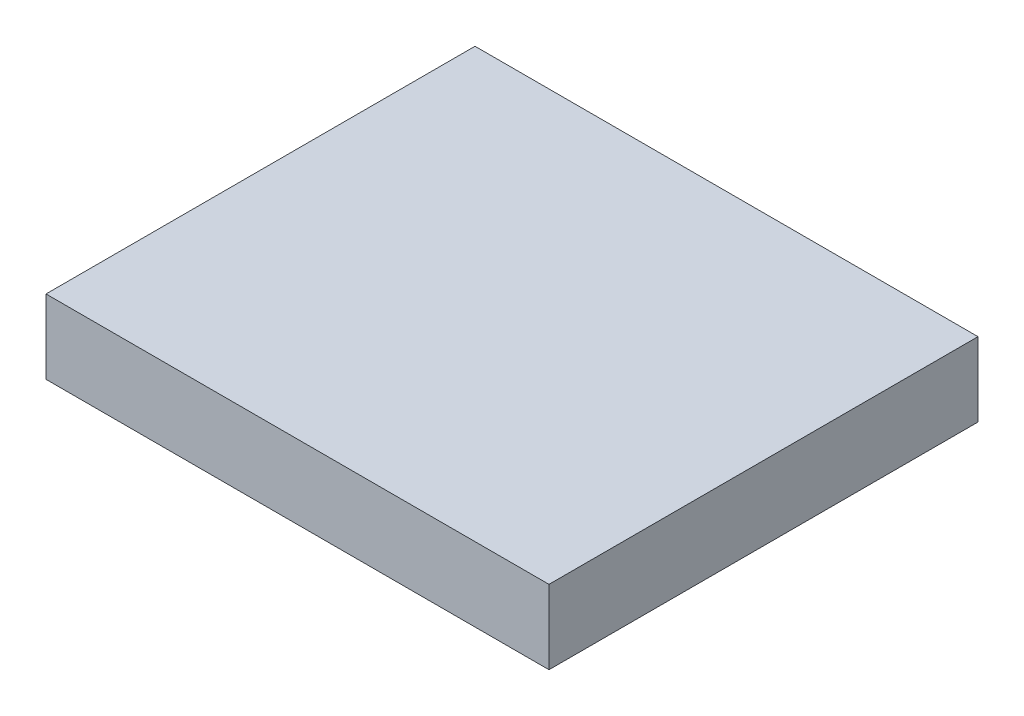
ISO-10303-21;
HEADER;
FILE_DESCRIPTION(('STEP AP214'),'2;1');
FILE_NAME('part.step','',(''),(''),'','','');
FILE_SCHEMA(('AUTOMOTIVE_DESIGN { 1 0 10303 214 1 1 1 1 }'));
ENDSEC;
DATA;
#1=APPLICATION_CONTEXT('core data for automotive mechanical design processes');
#2=APPLICATION_PROTOCOL_DEFINITION('international standard','automotive_design',2000,#1);
#3=PRODUCT_CONTEXT('',#1,'mechanical');
#4=PRODUCT('Part','Part','',(#3));
#5=PRODUCT_RELATED_PRODUCT_CATEGORY('part','',(#4));
#6=PRODUCT_DEFINITION_FORMATION('','',#4);
#7=PRODUCT_DEFINITION_CONTEXT('part definition',#1,'design');
#8=PRODUCT_DEFINITION('design','',#6,#7);
#9=PRODUCT_DEFINITION_SHAPE('','',#8);
#10=(LENGTH_UNIT() NAMED_UNIT(*) SI_UNIT(.MILLI.,.METRE.));
#11=(NAMED_UNIT(*) PLANE_ANGLE_UNIT() SI_UNIT($,.RADIAN.));
#12=(NAMED_UNIT(*) SI_UNIT($,.STERADIAN.) SOLID_ANGLE_UNIT());
#13=UNCERTAINTY_MEASURE_WITH_UNIT(LENGTH_MEASURE(1.E-05),#10,'distance_accuracy_value','');
#14=(GEOMETRIC_REPRESENTATION_CONTEXT(3) GLOBAL_UNCERTAINTY_ASSIGNED_CONTEXT((#13)) GLOBAL_UNIT_ASSIGNED_CONTEXT((#10,
#11,#12)) REPRESENTATION_CONTEXT('',''));
#15=CARTESIAN_POINT('',(0.,0.,0.));
#16=DIRECTION('',(0.,0.,1.));
#17=DIRECTION('',(1.,0.,0.));
#18=AXIS2_PLACEMENT_3D('',#15,#16,#17);
#19=CARTESIAN_POINT('',(17.,5.,-14.5));
#20=DIRECTION('',(-1.,0.,0.));
#21=DIRECTION('',(0.,0.,1.));
#22=AXIS2_PLACEMENT_3D('',#19,#20,#21);
#23=PLANE('',#22);
#24=DIRECTION('',(0.,0.,-1.));
#25=VECTOR('',#24,1.);
#26=CARTESIAN_POINT('',(17.,0.,-14.5));
#27=LINE('',#26,#25);
#28=CARTESIAN_POINT('',(17.,0.,14.5));
#29=VERTEX_POINT('',#28);
#30=CARTESIAN_POINT('',(17.,0.,-14.5));
#31=VERTEX_POINT('',#30);
#32=EDGE_CURVE('E104',#29,#31,#27,.T.);
#33=ORIENTED_EDGE('',*,*,#32,.T.);
#34=DIRECTION('',(0.,-1.,0.));
#35=VECTOR('',#34,1.);
#36=CARTESIAN_POINT('',(17.,5.,-14.5));
#37=LINE('',#36,#35);
#38=CARTESIAN_POINT('',(17.,5.,-14.5));
#39=VERTEX_POINT('',#38);
#40=EDGE_CURVE('E11',#39,#31,#37,.T.);
#41=ORIENTED_EDGE('',*,*,#40,.F.);
#42=DIRECTION('',(0.,0.,-1.));
#43=VECTOR('',#42,1.);
#44=CARTESIAN_POINT('',(17.,5.,-14.5));
#45=LINE('',#44,#43);
#46=CARTESIAN_POINT('',(17.,5.,14.5));
#47=VERTEX_POINT('',#46);
#48=EDGE_CURVE('E92',#47,#39,#45,.T.);
#49=ORIENTED_EDGE('',*,*,#48,.F.);
#50=DIRECTION('',(0.,-1.,0.));
#51=VECTOR('',#50,1.);
#52=CARTESIAN_POINT('',(17.,5.,14.5));
#53=LINE('',#52,#51);
#54=EDGE_CURVE('E100',#47,#29,#53,.T.);
#55=ORIENTED_EDGE('',*,*,#54,.T.);
#56=EDGE_LOOP('',(#33,#41,#49,#55));
#57=FACE_BOUND('',#56,.T.);
#58=ADVANCED_FACE('F41',(#57),#23,.F.);
#59=CARTESIAN_POINT('',(-17.,5.,-14.5));
#60=DIRECTION('',(0.,0.,1.));
#61=DIRECTION('',(1.,0.,0.));
#62=AXIS2_PLACEMENT_3D('',#59,#60,#61);
#63=PLANE('',#62);
#64=DIRECTION('',(-1.,0.,0.));
#65=VECTOR('',#64,1.);
#66=CARTESIAN_POINT('',(-17.,0.,-14.5));
#67=LINE('',#66,#65);
#68=CARTESIAN_POINT('',(-17.,0.,-14.5));
#69=VERTEX_POINT('',#68);
#70=EDGE_CURVE('E96',#31,#69,#67,.T.);
#71=ORIENTED_EDGE('',*,*,#70,.T.);
#72=DIRECTION('',(0.,-1.,0.));
#73=VECTOR('',#72,1.);
#74=CARTESIAN_POINT('',(-17.,5.,-14.5));
#75=LINE('',#74,#73);
#76=CARTESIAN_POINT('',(-17.,5.,-14.5));
#77=VERTEX_POINT('',#76);
#78=EDGE_CURVE('E49',#77,#69,#75,.T.);
#79=ORIENTED_EDGE('',*,*,#78,.F.);
#80=DIRECTION('',(-1.,0.,0.));
#81=VECTOR('',#80,1.);
#82=CARTESIAN_POINT('',(-17.,5.,-14.5));
#83=LINE('',#82,#81);
#84=EDGE_CURVE('E87',#39,#77,#83,.T.);
#85=ORIENTED_EDGE('',*,*,#84,.F.);
#86=ORIENTED_EDGE('',*,*,#40,.T.);
#87=EDGE_LOOP('',(#71,#79,#85,#86));
#88=FACE_BOUND('',#87,.T.);
#89=ADVANCED_FACE('F95',(#88),#63,.F.);
#90=CARTESIAN_POINT('',(-17.,5.,-14.5));
#91=DIRECTION('',(1.,0.,0.));
#92=DIRECTION('',(0.,0.,-1.));
#93=AXIS2_PLACEMENT_3D('',#90,#91,#92);
#94=PLANE('',#93);
#95=DIRECTION('',(0.,0.,1.));
#96=VECTOR('',#95,1.);
#97=CARTESIAN_POINT('',(-17.,0.,-14.5));
#98=LINE('',#97,#96);
#99=CARTESIAN_POINT('',(-17.,0.,14.5));
#100=VERTEX_POINT('',#99);
#101=EDGE_CURVE('E74',#69,#100,#98,.T.);
#102=ORIENTED_EDGE('',*,*,#101,.T.);
#103=DIRECTION('',(0.,-1.,0.));
#104=VECTOR('',#103,1.);
#105=CARTESIAN_POINT('',(-17.,5.,14.5));
#106=LINE('',#105,#104);
#107=CARTESIAN_POINT('',(-17.,5.,14.5));
#108=VERTEX_POINT('',#107);
#109=EDGE_CURVE('E97',#108,#100,#106,.T.);
#110=ORIENTED_EDGE('',*,*,#109,.F.);
#111=DIRECTION('',(0.,0.,1.));
#112=VECTOR('',#111,1.);
#113=CARTESIAN_POINT('',(-17.,5.,-14.5));
#114=LINE('',#113,#112);
#115=EDGE_CURVE('E90',#77,#108,#114,.T.);
#116=ORIENTED_EDGE('',*,*,#115,.F.);
#117=ORIENTED_EDGE('',*,*,#78,.T.);
#118=EDGE_LOOP('',(#102,#110,#116,#117));
#119=FACE_BOUND('',#118,.T.);
#120=ADVANCED_FACE('F98',(#119),#94,.F.);
#121=CARTESIAN_POINT('',(-17.,5.,14.5));
#122=DIRECTION('',(0.,0.,-1.));
#123=DIRECTION('',(-1.,0.,0.));
#124=AXIS2_PLACEMENT_3D('',#121,#122,#123);
#125=PLANE('',#124);
#126=DIRECTION('',(1.,0.,0.));
#127=VECTOR('',#126,1.);
#128=CARTESIAN_POINT('',(-17.,0.,14.5));
#129=LINE('',#128,#127);
#130=EDGE_CURVE('E80',#100,#29,#129,.T.);
#131=ORIENTED_EDGE('',*,*,#130,.T.);
#132=ORIENTED_EDGE('',*,*,#54,.F.);
#133=DIRECTION('',(1.,0.,0.));
#134=VECTOR('',#133,1.);
#135=CARTESIAN_POINT('',(-17.,5.,14.5));
#136=LINE('',#135,#134);
#137=EDGE_CURVE('E57',#108,#47,#136,.T.);
#138=ORIENTED_EDGE('',*,*,#137,.F.);
#139=ORIENTED_EDGE('',*,*,#109,.T.);
#140=EDGE_LOOP('',(#131,#132,#138,#139));
#141=FACE_BOUND('',#140,.T.);
#142=ADVANCED_FACE('F111',(#141),#125,.F.);
#143=CARTESIAN_POINT('',(0.,5.,0.));
#144=DIRECTION('',(0.,1.,0.));
#145=DIRECTION('',(0.,0.,1.));
#146=AXIS2_PLACEMENT_3D('',#143,#144,#145);
#147=PLANE('',#146);
#148=ORIENTED_EDGE('',*,*,#48,.T.);
#149=ORIENTED_EDGE('',*,*,#84,.T.);
#150=ORIENTED_EDGE('',*,*,#115,.T.);
#151=ORIENTED_EDGE('',*,*,#137,.T.);
#152=EDGE_LOOP('',(#148,#149,#150,#151));
#153=FACE_BOUND('',#152,.T.);
#154=ADVANCED_FACE('F88',(#153),#147,.T.);
#155=CARTESIAN_POINT('',(0.,0.,0.));
#156=DIRECTION('',(0.,1.,0.));
#157=DIRECTION('',(0.,0.,1.));
#158=AXIS2_PLACEMENT_3D('',#155,#156,#157);
#159=PLANE('',#158);
#160=ORIENTED_EDGE('',*,*,#32,.F.);
#161=ORIENTED_EDGE('',*,*,#130,.F.);
#162=ORIENTED_EDGE('',*,*,#101,.F.);
#163=ORIENTED_EDGE('',*,*,#70,.F.);
#164=EDGE_LOOP('',(#160,#161,#162,#163));
#165=FACE_BOUND('',#164,.T.);
#166=ADVANCED_FACE('F114',(#165),#159,.F.);
#167=CLOSED_SHELL('',(#58,#89,#120,#142,#154,#166));
#168=MANIFOLD_SOLID_BREP('B2',#167);
#169=ADVANCED_BREP_SHAPE_REPRESENTATION('',(#18,#168),#14);
#170=SHAPE_DEFINITION_REPRESENTATION(#9,#169);
ENDSEC;
END-ISO-10303-21;
